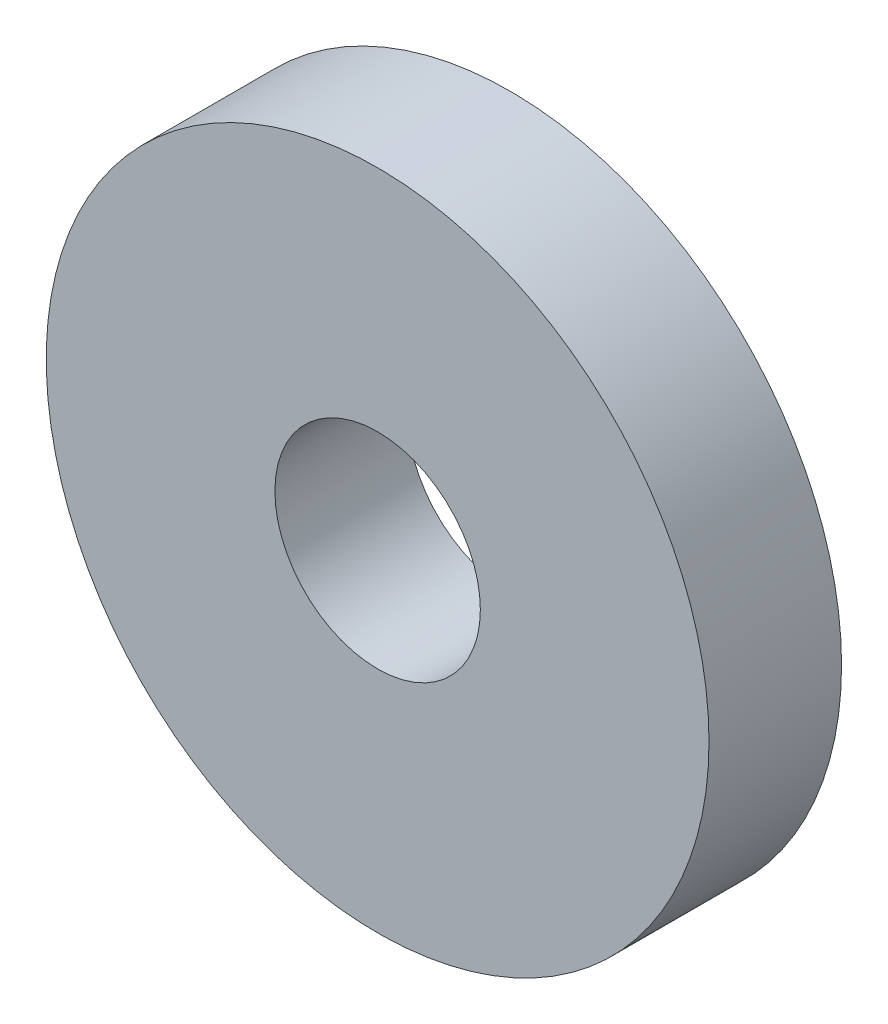
ISO-10303-21;
HEADER;
FILE_DESCRIPTION(('STEP AP214'),'2;1');
FILE_NAME('part.step','',(''),(''),'','','');
FILE_SCHEMA(('AUTOMOTIVE_DESIGN { 1 0 10303 214 1 1 1 1 }'));
ENDSEC;
DATA;
#1=APPLICATION_CONTEXT('core data for automotive mechanical design processes');
#2=APPLICATION_PROTOCOL_DEFINITION('international standard','automotive_design',2000,#1);
#3=PRODUCT_CONTEXT('',#1,'mechanical');
#4=PRODUCT('Part','Part','',(#3));
#5=PRODUCT_RELATED_PRODUCT_CATEGORY('part','',(#4));
#6=PRODUCT_DEFINITION_FORMATION('','',#4);
#7=PRODUCT_DEFINITION_CONTEXT('part definition',#1,'design');
#8=PRODUCT_DEFINITION('design','',#6,#7);
#9=PRODUCT_DEFINITION_SHAPE('','',#8);
#10=(LENGTH_UNIT() NAMED_UNIT(*) SI_UNIT(.MILLI.,.METRE.));
#11=(NAMED_UNIT(*) PLANE_ANGLE_UNIT() SI_UNIT($,.RADIAN.));
#12=(NAMED_UNIT(*) SI_UNIT($,.STERADIAN.) SOLID_ANGLE_UNIT());
#13=UNCERTAINTY_MEASURE_WITH_UNIT(LENGTH_MEASURE(1.E-05),#10,'distance_accuracy_value','');
#14=(GEOMETRIC_REPRESENTATION_CONTEXT(3) GLOBAL_UNCERTAINTY_ASSIGNED_CONTEXT((#13)) GLOBAL_UNIT_ASSIGNED_CONTEXT((#10,
#11,#12)) REPRESENTATION_CONTEXT('',''));
#15=CARTESIAN_POINT('',(0.,0.,0.));
#16=DIRECTION('',(0.,0.,1.));
#17=DIRECTION('',(1.,0.,0.));
#18=AXIS2_PLACEMENT_3D('',#15,#16,#17);
#19=CARTESIAN_POINT('',(0.,0.,10.));
#20=DIRECTION('',(0.,0.,-1.));
#21=DIRECTION('',(-1.,0.,0.));
#22=AXIS2_PLACEMENT_3D('',#19,#20,#21);
#23=CYLINDRICAL_SURFACE('',#22,25.);
#24=CARTESIAN_POINT('',(0.,0.,10.));
#25=DIRECTION('',(0.,0.,1.));
#26=DIRECTION('',(1.,0.,0.));
#27=AXIS2_PLACEMENT_3D('',#24,#25,#26);
#28=CIRCLE('',#27,25.);
#29=CARTESIAN_POINT('',(25.,0.,10.));
#30=VERTEX_POINT('',#29);
#31=EDGE_CURVE('E11',#30,#30,#28,.T.);
#32=ORIENTED_EDGE('',*,*,#31,.F.);
#33=EDGE_LOOP('',(#32));
#34=FACE_BOUND('',#33,.T.);
#35=CARTESIAN_POINT('',(0.,0.,0.));
#36=DIRECTION('',(0.,0.,1.));
#37=DIRECTION('',(1.,0.,0.));
#38=AXIS2_PLACEMENT_3D('',#35,#36,#37);
#39=CIRCLE('',#38,25.);
#40=CARTESIAN_POINT('',(25.,0.,0.));
#41=VERTEX_POINT('',#40);
#42=EDGE_CURVE('E41',#41,#41,#39,.T.);
#43=ORIENTED_EDGE('',*,*,#42,.T.);
#44=EDGE_LOOP('',(#43));
#45=FACE_BOUND('',#44,.T.);
#46=ADVANCED_FACE('F38',(#34,#45),#23,.T.);
#47=CARTESIAN_POINT('',(0.,0.,10.));
#48=DIRECTION('',(0.,0.,1.));
#49=DIRECTION('',(1.,0.,0.));
#50=AXIS2_PLACEMENT_3D('',#47,#48,#49);
#51=PLANE('',#50);
#52=CARTESIAN_POINT('',(0.,0.,10.));
#53=DIRECTION('',(0.,0.,1.));
#54=DIRECTION('',(1.,0.,0.));
#55=AXIS2_PLACEMENT_3D('',#52,#53,#54);
#56=CIRCLE('',#55,7.74999999999999);
#57=CARTESIAN_POINT('',(7.74999999999999,0.,10.));
#58=VERTEX_POINT('',#57);
#59=EDGE_CURVE('E94',#58,#58,#56,.T.);
#60=ORIENTED_EDGE('',*,*,#59,.F.);
#61=EDGE_LOOP('',(#60));
#62=FACE_BOUND('',#61,.T.);
#63=ORIENTED_EDGE('',*,*,#31,.T.);
#64=EDGE_LOOP('',(#63));
#65=FACE_BOUND('',#64,.T.);
#66=ADVANCED_FACE('F105',(#62,#65),#51,.T.);
#67=CARTESIAN_POINT('',(0.,0.,0.));
#68=DIRECTION('',(0.,0.,1.));
#69=DIRECTION('',(1.,0.,0.));
#70=AXIS2_PLACEMENT_3D('',#67,#68,#69);
#71=PLANE('',#70);
#72=CARTESIAN_POINT('',(0.,18.,0.));
#73=DIRECTION('',(0.,0.,-1.));
#74=DIRECTION('',(-1.,0.,0.));
#75=AXIS2_PLACEMENT_3D('',#72,#73,#74);
#76=CIRCLE('',#75,2.5);
#77=CARTESIAN_POINT('',(-2.5,18.,0.));
#78=VERTEX_POINT('',#77);
#79=EDGE_CURVE('E69',#78,#78,#76,.T.);
#80=ORIENTED_EDGE('',*,*,#79,.F.);
#81=EDGE_LOOP('',(#80));
#82=FACE_BOUND('',#81,.T.);
#83=CARTESIAN_POINT('',(18.,0.,0.));
#84=DIRECTION('',(0.,0.,-1.));
#85=DIRECTION('',(-1.,0.,0.));
#86=AXIS2_PLACEMENT_3D('',#83,#84,#85);
#87=CIRCLE('',#86,2.5);
#88=CARTESIAN_POINT('',(15.5,0.,0.));
#89=VERTEX_POINT('',#88);
#90=EDGE_CURVE('E68',#89,#89,#87,.T.);
#91=ORIENTED_EDGE('',*,*,#90,.F.);
#92=EDGE_LOOP('',(#91));
#93=FACE_BOUND('',#92,.T.);
#94=CARTESIAN_POINT('',(-18.,0.,0.));
#95=DIRECTION('',(0.,0.,-1.));
#96=DIRECTION('',(-1.,0.,0.));
#97=AXIS2_PLACEMENT_3D('',#94,#95,#96);
#98=CIRCLE('',#97,2.5);
#99=CARTESIAN_POINT('',(-20.5,0.,0.));
#100=VERTEX_POINT('',#99);
#101=EDGE_CURVE('E79',#100,#100,#98,.T.);
#102=ORIENTED_EDGE('',*,*,#101,.F.);
#103=EDGE_LOOP('',(#102));
#104=FACE_BOUND('',#103,.T.);
#105=CARTESIAN_POINT('',(0.,-18.,0.));
#106=DIRECTION('',(0.,0.,-1.));
#107=DIRECTION('',(-1.,0.,0.));
#108=AXIS2_PLACEMENT_3D('',#105,#106,#107);
#109=CIRCLE('',#108,2.5);
#110=CARTESIAN_POINT('',(-2.5,-18.,0.));
#111=VERTEX_POINT('',#110);
#112=EDGE_CURVE('E85',#111,#111,#109,.T.);
#113=ORIENTED_EDGE('',*,*,#112,.F.);
#114=EDGE_LOOP('',(#113));
#115=FACE_BOUND('',#114,.T.);
#116=CARTESIAN_POINT('',(0.,0.,0.));
#117=DIRECTION('',(0.,0.,-1.));
#118=DIRECTION('',(-1.,0.,0.));
#119=AXIS2_PLACEMENT_3D('',#116,#117,#118);
#120=CIRCLE('',#119,7.74999999999999);
#121=CARTESIAN_POINT('',(-7.74999999999999,0.,0.));
#122=VERTEX_POINT('',#121);
#123=EDGE_CURVE('E91',#122,#122,#120,.T.);
#124=ORIENTED_EDGE('',*,*,#123,.F.);
#125=EDGE_LOOP('',(#124));
#126=FACE_BOUND('',#125,.T.);
#127=ORIENTED_EDGE('',*,*,#42,.F.);
#128=EDGE_LOOP('',(#127));
#129=FACE_BOUND('',#128,.T.);
#130=ADVANCED_FACE('F102',(#82,#93,#104,#115,#126,#129),#71,.F.);
#131=CARTESIAN_POINT('',(0.,0.,0.));
#132=DIRECTION('',(0.,0.,-1.));
#133=DIRECTION('',(-1.,0.,0.));
#134=AXIS2_PLACEMENT_3D('',#131,#132,#133);
#135=CYLINDRICAL_SURFACE('',#134,7.74999999999999);
#136=ORIENTED_EDGE('',*,*,#59,.T.);
#137=EDGE_LOOP('',(#136));
#138=FACE_BOUND('',#137,.T.);
#139=ORIENTED_EDGE('',*,*,#123,.T.);
#140=EDGE_LOOP('',(#139));
#141=FACE_BOUND('',#140,.T.);
#142=ADVANCED_FACE('F104',(#138,#141),#135,.F.);
#143=CARTESIAN_POINT('',(0.,-18.,5.));
#144=DIRECTION('',(0.,0.,-1.));
#145=DIRECTION('',(-1.,0.,0.));
#146=AXIS2_PLACEMENT_3D('',#143,#144,#145);
#147=CONICAL_SURFACE('',#146,2.5,1.02974425867665);
#148=CARTESIAN_POINT('',(0.,-18.,6.5021515475689));
#149=VERTEX_POINT('',#148);
#150=VERTEX_LOOP('',#149);
#151=FACE_BOUND('',#150,.T.);
#152=CARTESIAN_POINT('',(0.,-18.,5.));
#153=DIRECTION('',(0.,0.,-1.));
#154=DIRECTION('',(-1.,0.,0.));
#155=AXIS2_PLACEMENT_3D('',#152,#153,#154);
#156=CIRCLE('',#155,2.5);
#157=CARTESIAN_POINT('',(-2.5,-18.,5.));
#158=VERTEX_POINT('',#157);
#159=EDGE_CURVE('E88',#158,#158,#156,.T.);
#160=ORIENTED_EDGE('',*,*,#159,.T.);
#161=EDGE_LOOP('',(#160));
#162=FACE_BOUND('',#161,.T.);
#163=ADVANCED_FACE('F111',(#151,#162),#147,.F.);
#164=CARTESIAN_POINT('',(0.,-18.,0.));
#165=DIRECTION('',(0.,0.,-1.));
#166=DIRECTION('',(-1.,0.,0.));
#167=AXIS2_PLACEMENT_3D('',#164,#165,#166);
#168=CYLINDRICAL_SURFACE('',#167,2.5);
#169=ORIENTED_EDGE('',*,*,#159,.F.);
#170=EDGE_LOOP('',(#169));
#171=FACE_BOUND('',#170,.T.);
#172=ORIENTED_EDGE('',*,*,#112,.T.);
#173=EDGE_LOOP('',(#172));
#174=FACE_BOUND('',#173,.T.);
#175=ADVANCED_FACE('F147',(#171,#174),#168,.F.);
#176=CARTESIAN_POINT('',(-18.,0.,5.));
#177=DIRECTION('',(0.,0.,-1.));
#178=DIRECTION('',(-1.,0.,0.));
#179=AXIS2_PLACEMENT_3D('',#176,#177,#178);
#180=CONICAL_SURFACE('',#179,2.5,1.02974425867665);
#181=CARTESIAN_POINT('',(-18.,0.,6.5021515475689));
#182=VERTEX_POINT('',#181);
#183=VERTEX_LOOP('',#182);
#184=FACE_BOUND('',#183,.T.);
#185=CARTESIAN_POINT('',(-18.,0.,5.));
#186=DIRECTION('',(0.,0.,-1.));
#187=DIRECTION('',(-1.,0.,0.));
#188=AXIS2_PLACEMENT_3D('',#185,#186,#187);
#189=CIRCLE('',#188,2.5);
#190=CARTESIAN_POINT('',(-20.5,0.,5.));
#191=VERTEX_POINT('',#190);
#192=EDGE_CURVE('E82',#191,#191,#189,.T.);
#193=ORIENTED_EDGE('',*,*,#192,.T.);
#194=EDGE_LOOP('',(#193));
#195=FACE_BOUND('',#194,.T.);
#196=ADVANCED_FACE('F157',(#184,#195),#180,.F.);
#197=CARTESIAN_POINT('',(-18.,0.,0.));
#198=DIRECTION('',(0.,0.,-1.));
#199=DIRECTION('',(-1.,0.,0.));
#200=AXIS2_PLACEMENT_3D('',#197,#198,#199);
#201=CYLINDRICAL_SURFACE('',#200,2.5);
#202=ORIENTED_EDGE('',*,*,#192,.F.);
#203=EDGE_LOOP('',(#202));
#204=FACE_BOUND('',#203,.T.);
#205=ORIENTED_EDGE('',*,*,#101,.T.);
#206=EDGE_LOOP('',(#205));
#207=FACE_BOUND('',#206,.T.);
#208=ADVANCED_FACE('F168',(#204,#207),#201,.F.);
#209=CARTESIAN_POINT('',(18.,0.,5.));
#210=DIRECTION('',(0.,0.,-1.));
#211=DIRECTION('',(-1.,0.,0.));
#212=AXIS2_PLACEMENT_3D('',#209,#210,#211);
#213=CONICAL_SURFACE('',#212,2.5,1.02974425867665);
#214=CARTESIAN_POINT('',(18.,0.,6.5021515475689));
#215=VERTEX_POINT('',#214);
#216=VERTEX_LOOP('',#215);
#217=FACE_BOUND('',#216,.T.);
#218=CARTESIAN_POINT('',(18.,0.,5.));
#219=DIRECTION('',(0.,0.,-1.));
#220=DIRECTION('',(-1.,0.,0.));
#221=AXIS2_PLACEMENT_3D('',#218,#219,#220);
#222=CIRCLE('',#221,2.5);
#223=CARTESIAN_POINT('',(15.5,0.,5.));
#224=VERTEX_POINT('',#223);
#225=EDGE_CURVE('E72',#224,#224,#222,.T.);
#226=ORIENTED_EDGE('',*,*,#225,.T.);
#227=EDGE_LOOP('',(#226));
#228=FACE_BOUND('',#227,.T.);
#229=ADVANCED_FACE('F177',(#217,#228),#213,.F.);
#230=CARTESIAN_POINT('',(18.,0.,0.));
#231=DIRECTION('',(0.,0.,-1.));
#232=DIRECTION('',(-1.,0.,0.));
#233=AXIS2_PLACEMENT_3D('',#230,#231,#232);
#234=CYLINDRICAL_SURFACE('',#233,2.5);
#235=ORIENTED_EDGE('',*,*,#225,.F.);
#236=EDGE_LOOP('',(#235));
#237=FACE_BOUND('',#236,.T.);
#238=ORIENTED_EDGE('',*,*,#90,.T.);
#239=EDGE_LOOP('',(#238));
#240=FACE_BOUND('',#239,.T.);
#241=ADVANCED_FACE('F62',(#237,#240),#234,.F.);
#242=CARTESIAN_POINT('',(0.,18.,5.));
#243=DIRECTION('',(0.,0.,-1.));
#244=DIRECTION('',(-1.,0.,0.));
#245=AXIS2_PLACEMENT_3D('',#242,#243,#244);
#246=CONICAL_SURFACE('',#245,2.5,1.02974425867665);
#247=CARTESIAN_POINT('',(0.,18.,6.5021515475689));
#248=VERTEX_POINT('',#247);
#249=VERTEX_LOOP('',#248);
#250=FACE_BOUND('',#249,.T.);
#251=CARTESIAN_POINT('',(0.,18.,5.));
#252=DIRECTION('',(0.,0.,-1.));
#253=DIRECTION('',(-1.,0.,0.));
#254=AXIS2_PLACEMENT_3D('',#251,#252,#253);
#255=CIRCLE('',#254,2.5);
#256=CARTESIAN_POINT('',(-2.5,18.,5.));
#257=VERTEX_POINT('',#256);
#258=EDGE_CURVE('E66',#257,#257,#255,.T.);
#259=ORIENTED_EDGE('',*,*,#258,.T.);
#260=EDGE_LOOP('',(#259));
#261=FACE_BOUND('',#260,.T.);
#262=ADVANCED_FACE('F58',(#250,#261),#246,.F.);
#263=CARTESIAN_POINT('',(0.,18.,0.));
#264=DIRECTION('',(0.,0.,-1.));
#265=DIRECTION('',(-1.,0.,0.));
#266=AXIS2_PLACEMENT_3D('',#263,#264,#265);
#267=CYLINDRICAL_SURFACE('',#266,2.5);
#268=ORIENTED_EDGE('',*,*,#258,.F.);
#269=EDGE_LOOP('',(#268));
#270=FACE_BOUND('',#269,.T.);
#271=ORIENTED_EDGE('',*,*,#79,.T.);
#272=EDGE_LOOP('',(#271));
#273=FACE_BOUND('',#272,.T.);
#274=ADVANCED_FACE('F61',(#270,#273),#267,.F.);
#275=CLOSED_SHELL('',(#46,#66,#130,#142,#163,#175,#196,#208,#229,#241,#262,#274));
#276=MANIFOLD_SOLID_BREP('B2',#275);
#277=ADVANCED_BREP_SHAPE_REPRESENTATION('',(#18,#276),#14);
#278=SHAPE_DEFINITION_REPRESENTATION(#9,#277);
ENDSEC;
END-ISO-10303-21;
